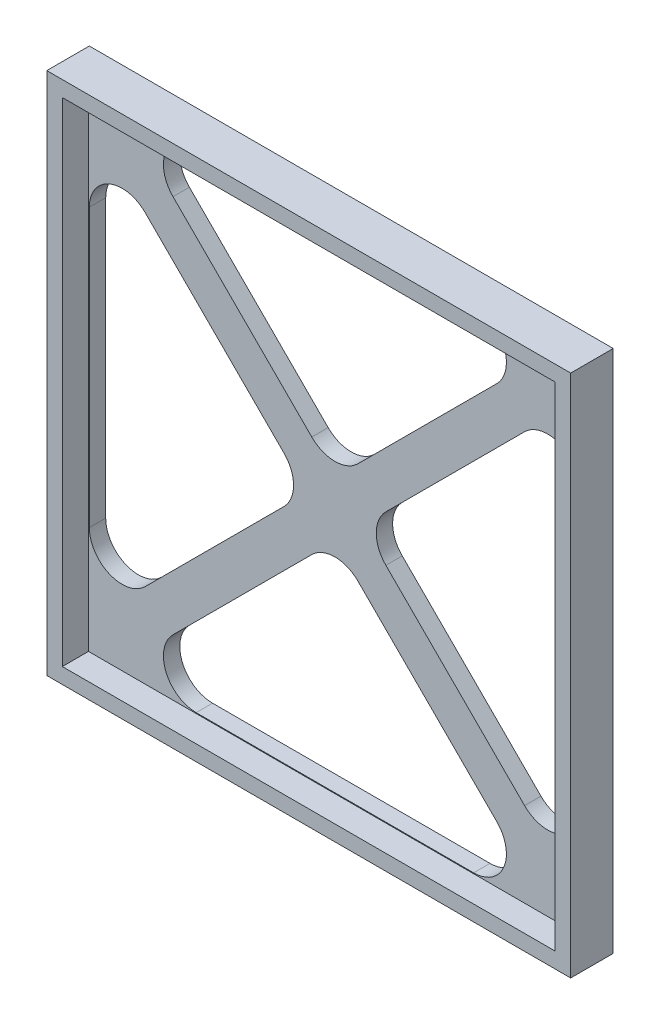
ISO-10303-21;
HEADER;
FILE_DESCRIPTION(('STEP AP214'),'2;1');
FILE_NAME('part.step','',(''),(''),'','','');
FILE_SCHEMA(('AUTOMOTIVE_DESIGN { 1 0 10303 214 1 1 1 1 }'));
ENDSEC;
DATA;
#1=APPLICATION_CONTEXT('core data for automotive mechanical design processes');
#2=APPLICATION_PROTOCOL_DEFINITION('international standard','automotive_design',2000,#1);
#3=PRODUCT_CONTEXT('',#1,'mechanical');
#4=PRODUCT('Part','Part','',(#3));
#5=PRODUCT_RELATED_PRODUCT_CATEGORY('part','',(#4));
#6=PRODUCT_DEFINITION_FORMATION('','',#4);
#7=PRODUCT_DEFINITION_CONTEXT('part definition',#1,'design');
#8=PRODUCT_DEFINITION('design','',#6,#7);
#9=PRODUCT_DEFINITION_SHAPE('','',#8);
#10=(LENGTH_UNIT() NAMED_UNIT(*) SI_UNIT(.MILLI.,.METRE.));
#11=(NAMED_UNIT(*) PLANE_ANGLE_UNIT() SI_UNIT($,.RADIAN.));
#12=(NAMED_UNIT(*) SI_UNIT($,.STERADIAN.) SOLID_ANGLE_UNIT());
#13=UNCERTAINTY_MEASURE_WITH_UNIT(LENGTH_MEASURE(1.E-05),#10,'distance_accuracy_value','');
#14=(GEOMETRIC_REPRESENTATION_CONTEXT(3) GLOBAL_UNCERTAINTY_ASSIGNED_CONTEXT((#13)) GLOBAL_UNIT_ASSIGNED_CONTEXT((#10,
#11,#12)) REPRESENTATION_CONTEXT('',''));
#15=CARTESIAN_POINT('',(0.,0.,0.));
#16=DIRECTION('',(0.,0.,1.));
#17=DIRECTION('',(1.,0.,0.));
#18=AXIS2_PLACEMENT_3D('',#15,#16,#17);
#19=CARTESIAN_POINT('',(0.,0.,5.));
#20=DIRECTION('',(0.,0.,1.));
#21=DIRECTION('',(1.,0.,0.));
#22=AXIS2_PLACEMENT_3D('',#19,#20,#21);
#23=PLANE('',#22);
#24=DIRECTION('',(1.,0.,0.));
#25=VECTOR('',#24,1.);
#26=CARTESIAN_POINT('',(75.,-75.,5.));
#27=LINE('',#26,#25);
#28=CARTESIAN_POINT('',(-42.3725830020305,-75.,5.));
#29=VERTEX_POINT('',#28);
#30=CARTESIAN_POINT('',(42.3725830020305,-75.,5.));
#31=VERTEX_POINT('',#30);
#32=EDGE_CURVE('E398',#29,#31,#27,.T.);
#33=ORIENTED_EDGE('',*,*,#32,.F.);
#34=CARTESIAN_POINT('',(-42.3725830020305,-65.,5.));
#35=DIRECTION('',(0.,0.,1.));
#36=DIRECTION('',(1.,0.,0.));
#37=AXIS2_PLACEMENT_3D('',#34,#35,#36);
#38=CIRCLE('',#37,10.);
#39=CARTESIAN_POINT('',(-49.443650813896,-57.9289321881345,5.));
#40=VERTEX_POINT('',#39);
#41=EDGE_CURVE('E550',#29,#40,#38,.F.);
#42=ORIENTED_EDGE('',*,*,#41,.T.);
#43=DIRECTION('',(0.707106781186547,0.707106781186548,0.));
#44=VECTOR('',#43,1.);
#45=CARTESIAN_POINT('',(0.,-8.48528137423856,5.));
#46=LINE('',#45,#44);
#47=CARTESIAN_POINT('',(-7.07106781186547,-15.556349186104,5.));
#48=VERTEX_POINT('',#47);
#49=EDGE_CURVE('E360',#40,#48,#46,.T.);
#50=ORIENTED_EDGE('',*,*,#49,.T.);
#51=CARTESIAN_POINT('',(0.,-22.6274169979695,5.));
#52=DIRECTION('',(0.,0.,1.));
#53=DIRECTION('',(1.,0.,0.));
#54=AXIS2_PLACEMENT_3D('',#51,#52,#53);
#55=CIRCLE('',#54,10.);
#56=CARTESIAN_POINT('',(7.07106781186548,-15.556349186104,5.));
#57=VERTEX_POINT('',#56);
#58=EDGE_CURVE('E556',#48,#57,#55,.F.);
#59=ORIENTED_EDGE('',*,*,#58,.T.);
#60=DIRECTION('',(0.707106781186548,-0.707106781186547,0.));
#61=VECTOR('',#60,1.);
#62=CARTESIAN_POINT('',(0.,-8.48528137423856,5.));
#63=LINE('',#62,#61);
#64=CARTESIAN_POINT('',(49.443650813896,-57.9289321881345,5.));
#65=VERTEX_POINT('',#64);
#66=EDGE_CURVE('E364',#57,#65,#63,.T.);
#67=ORIENTED_EDGE('',*,*,#66,.T.);
#68=CARTESIAN_POINT('',(42.3725830020305,-65.,5.));
#69=DIRECTION('',(0.,0.,1.));
#70=DIRECTION('',(1.,0.,0.));
#71=AXIS2_PLACEMENT_3D('',#68,#69,#70);
#72=CIRCLE('',#71,10.);
#73=EDGE_CURVE('E544',#65,#31,#72,.F.);
#74=ORIENTED_EDGE('',*,*,#73,.T.);
#75=EDGE_LOOP('',(#33,#42,#50,#59,#67,#74));
#76=FACE_BOUND('',#75,.T.);
#77=DIRECTION('',(0.,1.,0.));
#78=VECTOR('',#77,1.);
#79=CARTESIAN_POINT('',(75.,-75.,5.));
#80=LINE('',#79,#78);
#81=CARTESIAN_POINT('',(75.,-42.3725830020305,5.));
#82=VERTEX_POINT('',#81);
#83=CARTESIAN_POINT('',(75.,42.3725830020305,5.));
#84=VERTEX_POINT('',#83);
#85=EDGE_CURVE('E402',#82,#84,#80,.T.);
#86=ORIENTED_EDGE('',*,*,#85,.F.);
#87=CARTESIAN_POINT('',(65.,-42.3725830020305,5.));
#88=DIRECTION('',(0.,0.,1.));
#89=DIRECTION('',(1.,0.,0.));
#90=AXIS2_PLACEMENT_3D('',#87,#88,#89);
#91=CIRCLE('',#90,10.);
#92=CARTESIAN_POINT('',(57.9289321881345,-49.4436508138959,5.));
#93=VERTEX_POINT('',#92);
#94=EDGE_CURVE('E532',#82,#93,#91,.F.);
#95=ORIENTED_EDGE('',*,*,#94,.T.);
#96=DIRECTION('',(-0.707106781186548,0.707106781186547,0.));
#97=VECTOR('',#96,1.);
#98=CARTESIAN_POINT('',(8.48528137423857,0.,5.));
#99=LINE('',#98,#97);
#100=CARTESIAN_POINT('',(15.5563491861041,-7.0710678118655,5.));
#101=VERTEX_POINT('',#100);
#102=EDGE_CURVE('E368',#93,#101,#99,.T.);
#103=ORIENTED_EDGE('',*,*,#102,.T.);
#104=CARTESIAN_POINT('',(22.6274169979695,0.,5.));
#105=DIRECTION('',(0.,0.,1.));
#106=DIRECTION('',(1.,0.,0.));
#107=AXIS2_PLACEMENT_3D('',#104,#105,#106);
#108=CIRCLE('',#107,10.);
#109=CARTESIAN_POINT('',(15.5563491861041,7.07106781186545,5.));
#110=VERTEX_POINT('',#109);
#111=EDGE_CURVE('E538',#101,#110,#108,.F.);
#112=ORIENTED_EDGE('',*,*,#111,.T.);
#113=DIRECTION('',(0.707106781186547,0.707106781186548,0.));
#114=VECTOR('',#113,1.);
#115=CARTESIAN_POINT('',(75.,66.5147186257614,5.));
#116=LINE('',#115,#114);
#117=CARTESIAN_POINT('',(57.9289321881345,49.4436508138959,5.));
#118=VERTEX_POINT('',#117);
#119=EDGE_CURVE('E372',#110,#118,#116,.T.);
#120=ORIENTED_EDGE('',*,*,#119,.T.);
#121=CARTESIAN_POINT('',(65.,42.3725830020305,5.));
#122=DIRECTION('',(0.,0.,1.));
#123=DIRECTION('',(1.,0.,0.));
#124=AXIS2_PLACEMENT_3D('',#121,#122,#123);
#125=CIRCLE('',#124,10.);
#126=EDGE_CURVE('E526',#118,#84,#125,.F.);
#127=ORIENTED_EDGE('',*,*,#126,.T.);
#128=EDGE_LOOP('',(#86,#95,#103,#112,#120,#127));
#129=FACE_BOUND('',#128,.T.);
#130=DIRECTION('',(-1.,0.,0.));
#131=VECTOR('',#130,1.);
#132=CARTESIAN_POINT('',(75.,75.,5.));
#133=LINE('',#132,#131);
#134=CARTESIAN_POINT('',(42.3725830020305,75.,5.));
#135=VERTEX_POINT('',#134);
#136=CARTESIAN_POINT('',(-42.3725830020305,75.,5.));
#137=VERTEX_POINT('',#136);
#138=EDGE_CURVE('E406',#135,#137,#133,.T.);
#139=ORIENTED_EDGE('',*,*,#138,.F.);
#140=CARTESIAN_POINT('',(42.3725830020305,65.,5.));
#141=DIRECTION('',(0.,0.,1.));
#142=DIRECTION('',(1.,0.,0.));
#143=AXIS2_PLACEMENT_3D('',#140,#141,#142);
#144=CIRCLE('',#143,10.);
#145=CARTESIAN_POINT('',(49.443650813896,57.9289321881345,5.));
#146=VERTEX_POINT('',#145);
#147=EDGE_CURVE('E586',#135,#146,#144,.F.);
#148=ORIENTED_EDGE('',*,*,#147,.T.);
#149=DIRECTION('',(-0.707106781186548,-0.707106781186548,0.));
#150=VECTOR('',#149,1.);
#151=CARTESIAN_POINT('',(66.5147186257614,75.,5.));
#152=LINE('',#151,#150);
#153=CARTESIAN_POINT('',(7.07106781186545,15.556349186104,5.));
#154=VERTEX_POINT('',#153);
#155=EDGE_CURVE('E376',#146,#154,#152,.T.);
#156=ORIENTED_EDGE('',*,*,#155,.T.);
#157=CARTESIAN_POINT('',(0.,22.6274169979695,5.));
#158=DIRECTION('',(0.,0.,1.));
#159=DIRECTION('',(1.,0.,0.));
#160=AXIS2_PLACEMENT_3D('',#157,#158,#159);
#161=CIRCLE('',#160,10.);
#162=CARTESIAN_POINT('',(-7.07106781186547,15.556349186104,5.));
#163=VERTEX_POINT('',#162);
#164=EDGE_CURVE('E48',#154,#163,#161,.F.);
#165=ORIENTED_EDGE('',*,*,#164,.T.);
#166=DIRECTION('',(-0.707106781186548,0.707106781186547,0.));
#167=VECTOR('',#166,1.);
#168=CARTESIAN_POINT('',(-66.5147186257615,75.,5.));
#169=LINE('',#168,#167);
#170=CARTESIAN_POINT('',(-49.443650813896,57.9289321881345,5.));
#171=VERTEX_POINT('',#170);
#172=EDGE_CURVE('E325',#163,#171,#169,.T.);
#173=ORIENTED_EDGE('',*,*,#172,.T.);
#174=CARTESIAN_POINT('',(-42.3725830020305,65.,5.));
#175=DIRECTION('',(0.,0.,1.));
#176=DIRECTION('',(1.,0.,0.));
#177=AXIS2_PLACEMENT_3D('',#174,#175,#176);
#178=CIRCLE('',#177,10.);
#179=EDGE_CURVE('E580',#171,#137,#178,.F.);
#180=ORIENTED_EDGE('',*,*,#179,.T.);
#181=EDGE_LOOP('',(#139,#148,#156,#165,#173,#180));
#182=FACE_BOUND('',#181,.T.);
#183=DIRECTION('',(0.,-1.,0.));
#184=VECTOR('',#183,1.);
#185=CARTESIAN_POINT('',(-75.,-75.,5.));
#186=LINE('',#185,#184);
#187=CARTESIAN_POINT('',(-75.,42.3725830020305,5.));
#188=VERTEX_POINT('',#187);
#189=CARTESIAN_POINT('',(-75.,-42.3725830020305,5.));
#190=VERTEX_POINT('',#189);
#191=EDGE_CURVE('E394',#188,#190,#186,.T.);
#192=ORIENTED_EDGE('',*,*,#191,.F.);
#193=CARTESIAN_POINT('',(-65.,42.3725830020305,5.));
#194=DIRECTION('',(0.,0.,1.));
#195=DIRECTION('',(1.,0.,0.));
#196=AXIS2_PLACEMENT_3D('',#193,#194,#195);
#197=CIRCLE('',#196,10.);
#198=CARTESIAN_POINT('',(-57.9289321881345,49.443650813896,5.));
#199=VERTEX_POINT('',#198);
#200=EDGE_CURVE('E568',#188,#199,#197,.F.);
#201=ORIENTED_EDGE('',*,*,#200,.T.);
#202=DIRECTION('',(0.707106781186548,-0.707106781186548,0.));
#203=VECTOR('',#202,1.);
#204=CARTESIAN_POINT('',(-75.,66.5147186257614,5.));
#205=LINE('',#204,#203);
#206=CARTESIAN_POINT('',(-15.556349186104,7.07106781186544,5.));
#207=VERTEX_POINT('',#206);
#208=EDGE_CURVE('E319',#199,#207,#205,.T.);
#209=ORIENTED_EDGE('',*,*,#208,.T.);
#210=CARTESIAN_POINT('',(-22.6274169979695,0.,5.));
#211=DIRECTION('',(0.,0.,1.));
#212=DIRECTION('',(1.,0.,0.));
#213=AXIS2_PLACEMENT_3D('',#210,#211,#212);
#214=CIRCLE('',#213,10.);
#215=CARTESIAN_POINT('',(-15.556349186104,-7.07106781186549,5.));
#216=VERTEX_POINT('',#215);
#217=EDGE_CURVE('E574',#207,#216,#214,.F.);
#218=ORIENTED_EDGE('',*,*,#217,.T.);
#219=DIRECTION('',(-0.707106781186547,-0.707106781186548,0.));
#220=VECTOR('',#219,1.);
#221=CARTESIAN_POINT('',(-8.48528137423855,0.,5.));
#222=LINE('',#221,#220);
#223=CARTESIAN_POINT('',(-57.9289321881345,-49.443650813896,5.));
#224=VERTEX_POINT('',#223);
#225=EDGE_CURVE('E356',#216,#224,#222,.T.);
#226=ORIENTED_EDGE('',*,*,#225,.T.);
#227=CARTESIAN_POINT('',(-65.,-42.3725830020305,5.));
#228=DIRECTION('',(0.,0.,1.));
#229=DIRECTION('',(1.,0.,0.));
#230=AXIS2_PLACEMENT_3D('',#227,#228,#229);
#231=CIRCLE('',#230,10.);
#232=EDGE_CURVE('E562',#224,#190,#231,.F.);
#233=ORIENTED_EDGE('',*,*,#232,.T.);
#234=EDGE_LOOP('',(#192,#201,#209,#218,#226,#233));
#235=FACE_BOUND('',#234,.T.);
#236=DIRECTION('',(-1.,0.,0.));
#237=VECTOR('',#236,1.);
#238=CARTESIAN_POINT('',(75.25,75.25,5.));
#239=LINE('',#238,#237);
#240=CARTESIAN_POINT('',(75.25,75.25,5.));
#241=VERTEX_POINT('',#240);
#242=CARTESIAN_POINT('',(-75.25,75.25,5.));
#243=VERTEX_POINT('',#242);
#244=EDGE_CURVE('E262',#241,#243,#239,.T.);
#245=ORIENTED_EDGE('',*,*,#244,.T.);
#246=DIRECTION('',(0.,-1.,0.));
#247=VECTOR('',#246,1.);
#248=CARTESIAN_POINT('',(-75.25,-75.25,5.));
#249=LINE('',#248,#247);
#250=CARTESIAN_POINT('',(-75.25,-75.25,5.));
#251=VERTEX_POINT('',#250);
#252=EDGE_CURVE('E285',#243,#251,#249,.T.);
#253=ORIENTED_EDGE('',*,*,#252,.T.);
#254=DIRECTION('',(1.,0.,0.));
#255=VECTOR('',#254,1.);
#256=CARTESIAN_POINT('',(75.25,-75.25,5.));
#257=LINE('',#256,#255);
#258=CARTESIAN_POINT('',(75.25,-75.25,5.));
#259=VERTEX_POINT('',#258);
#260=EDGE_CURVE('E268',#251,#259,#257,.T.);
#261=ORIENTED_EDGE('',*,*,#260,.T.);
#262=DIRECTION('',(0.,1.,0.));
#263=VECTOR('',#262,1.);
#264=CARTESIAN_POINT('',(75.25,-75.25,5.));
#265=LINE('',#264,#263);
#266=EDGE_CURVE('E290',#259,#241,#265,.T.);
#267=ORIENTED_EDGE('',*,*,#266,.T.);
#268=EDGE_LOOP('',(#245,#253,#261,#267));
#269=FACE_BOUND('',#268,.T.);
#270=ADVANCED_FACE('F39',(#76,#129,#182,#235,#269),#23,.T.);
#271=CARTESIAN_POINT('',(-80.,80.,5.));
#272=DIRECTION('',(1.,0.,0.));
#273=DIRECTION('',(0.,1.,0.));
#274=AXIS2_PLACEMENT_3D('',#271,#272,#273);
#275=PLANE('',#274);
#276=DIRECTION('',(0.,-1.,0.));
#277=VECTOR('',#276,1.);
#278=CARTESIAN_POINT('',(-80.,80.,0.));
#279=LINE('',#278,#277);
#280=CARTESIAN_POINT('',(-80.,80.,0.));
#281=VERTEX_POINT('',#280);
#282=CARTESIAN_POINT('',(-80.,-80.,0.));
#283=VERTEX_POINT('',#282);
#284=EDGE_CURVE('E414',#281,#283,#279,.T.);
#285=ORIENTED_EDGE('',*,*,#284,.T.);
#286=DIRECTION('',(0.,0.,-1.));
#287=VECTOR('',#286,1.);
#288=CARTESIAN_POINT('',(-80.,-80.,5.));
#289=LINE('',#288,#287);
#290=CARTESIAN_POINT('',(-80.,-80.,13.));
#291=VERTEX_POINT('',#290);
#292=EDGE_CURVE('E439',#291,#283,#289,.T.);
#293=ORIENTED_EDGE('',*,*,#292,.F.);
#294=DIRECTION('',(0.,-1.,0.));
#295=VECTOR('',#294,1.);
#296=CARTESIAN_POINT('',(-80.,80.,13.));
#297=LINE('',#296,#295);
#298=CARTESIAN_POINT('',(-80.,80.,13.));
#299=VERTEX_POINT('',#298);
#300=EDGE_CURVE('E270',#299,#291,#297,.T.);
#301=ORIENTED_EDGE('',*,*,#300,.F.);
#302=DIRECTION('',(0.,0.,-1.));
#303=VECTOR('',#302,1.);
#304=CARTESIAN_POINT('',(-80.,80.,5.));
#305=LINE('',#304,#303);
#306=EDGE_CURVE('E427',#299,#281,#305,.T.);
#307=ORIENTED_EDGE('',*,*,#306,.T.);
#308=EDGE_LOOP('',(#285,#293,#301,#307));
#309=FACE_BOUND('',#308,.T.);
#310=ADVANCED_FACE('F627',(#309),#275,.F.);
#311=CARTESIAN_POINT('',(-80.,-80.,5.));
#312=DIRECTION('',(0.,1.,0.));
#313=DIRECTION('',(-1.,0.,0.));
#314=AXIS2_PLACEMENT_3D('',#311,#312,#313);
#315=PLANE('',#314);
#316=DIRECTION('',(1.,0.,0.));
#317=VECTOR('',#316,1.);
#318=CARTESIAN_POINT('',(-80.,-80.,0.));
#319=LINE('',#318,#317);
#320=CARTESIAN_POINT('',(80.,-80.,0.));
#321=VERTEX_POINT('',#320);
#322=EDGE_CURVE('E418',#283,#321,#319,.T.);
#323=ORIENTED_EDGE('',*,*,#322,.T.);
#324=DIRECTION('',(0.,0.,-1.));
#325=VECTOR('',#324,1.);
#326=CARTESIAN_POINT('',(80.,-80.,5.));
#327=LINE('',#326,#325);
#328=CARTESIAN_POINT('',(80.,-80.,13.));
#329=VERTEX_POINT('',#328);
#330=EDGE_CURVE('E435',#329,#321,#327,.T.);
#331=ORIENTED_EDGE('',*,*,#330,.F.);
#332=DIRECTION('',(1.,0.,0.));
#333=VECTOR('',#332,1.);
#334=CARTESIAN_POINT('',(-80.,-80.,13.));
#335=LINE('',#334,#333);
#336=EDGE_CURVE('E307',#291,#329,#335,.T.);
#337=ORIENTED_EDGE('',*,*,#336,.F.);
#338=ORIENTED_EDGE('',*,*,#292,.T.);
#339=EDGE_LOOP('',(#323,#331,#337,#338));
#340=FACE_BOUND('',#339,.T.);
#341=ADVANCED_FACE('F633',(#340),#315,.F.);
#342=CARTESIAN_POINT('',(80.,80.,5.));
#343=DIRECTION('',(-1.,0.,0.));
#344=DIRECTION('',(0.,-1.,0.));
#345=AXIS2_PLACEMENT_3D('',#342,#343,#344);
#346=PLANE('',#345);
#347=DIRECTION('',(0.,1.,0.));
#348=VECTOR('',#347,1.);
#349=CARTESIAN_POINT('',(80.,80.,0.));
#350=LINE('',#349,#348);
#351=CARTESIAN_POINT('',(80.,80.,0.));
#352=VERTEX_POINT('',#351);
#353=EDGE_CURVE('E421',#321,#352,#350,.T.);
#354=ORIENTED_EDGE('',*,*,#353,.T.);
#355=DIRECTION('',(0.,0.,-1.));
#356=VECTOR('',#355,1.);
#357=CARTESIAN_POINT('',(80.,80.,5.));
#358=LINE('',#357,#356);
#359=CARTESIAN_POINT('',(80.,80.,13.));
#360=VERTEX_POINT('',#359);
#361=EDGE_CURVE('E431',#360,#352,#358,.T.);
#362=ORIENTED_EDGE('',*,*,#361,.F.);
#363=DIRECTION('',(0.,1.,0.));
#364=VECTOR('',#363,1.);
#365=CARTESIAN_POINT('',(80.,80.,13.));
#366=LINE('',#365,#364);
#367=EDGE_CURVE('E311',#329,#360,#366,.T.);
#368=ORIENTED_EDGE('',*,*,#367,.F.);
#369=ORIENTED_EDGE('',*,*,#330,.T.);
#370=EDGE_LOOP('',(#354,#362,#368,#369));
#371=FACE_BOUND('',#370,.T.);
#372=ADVANCED_FACE('F648',(#371),#346,.F.);
#373=CARTESIAN_POINT('',(-80.,80.,5.));
#374=DIRECTION('',(0.,-1.,0.));
#375=DIRECTION('',(1.,0.,0.));
#376=AXIS2_PLACEMENT_3D('',#373,#374,#375);
#377=PLANE('',#376);
#378=DIRECTION('',(-1.,0.,0.));
#379=VECTOR('',#378,1.);
#380=CARTESIAN_POINT('',(-80.,80.,0.));
#381=LINE('',#380,#379);
#382=EDGE_CURVE('E424',#352,#281,#381,.T.);
#383=ORIENTED_EDGE('',*,*,#382,.T.);
#384=ORIENTED_EDGE('',*,*,#306,.F.);
#385=DIRECTION('',(-1.,0.,0.));
#386=VECTOR('',#385,1.);
#387=CARTESIAN_POINT('',(-80.,80.,13.));
#388=LINE('',#387,#386);
#389=EDGE_CURVE('E315',#360,#299,#388,.T.);
#390=ORIENTED_EDGE('',*,*,#389,.F.);
#391=ORIENTED_EDGE('',*,*,#361,.T.);
#392=EDGE_LOOP('',(#383,#384,#390,#391));
#393=FACE_BOUND('',#392,.T.);
#394=ADVANCED_FACE('F644',(#393),#377,.F.);
#395=CARTESIAN_POINT('',(0.,0.,0.));
#396=DIRECTION('',(0.,0.,1.));
#397=DIRECTION('',(1.,0.,0.));
#398=AXIS2_PLACEMENT_3D('',#395,#396,#397);
#399=PLANE('',#398);
#400=DIRECTION('',(0.707106781186548,-0.707106781186548,0.));
#401=VECTOR('',#400,1.);
#402=CARTESIAN_POINT('',(-75.,66.5147186257614,0.));
#403=LINE('',#402,#401);
#404=CARTESIAN_POINT('',(-57.9289321881345,49.443650813896,0.));
#405=VERTEX_POINT('',#404);
#406=CARTESIAN_POINT('',(-15.556349186104,7.07106781186544,0.));
#407=VERTEX_POINT('',#406);
#408=EDGE_CURVE('E320',#405,#407,#403,.T.);
#409=ORIENTED_EDGE('',*,*,#408,.F.);
#410=CARTESIAN_POINT('',(-65.,42.3725830020305,0.));
#411=DIRECTION('',(0.,0.,1.));
#412=DIRECTION('',(1.,0.,0.));
#413=AXIS2_PLACEMENT_3D('',#410,#411,#412);
#414=CIRCLE('',#413,10.);
#415=CARTESIAN_POINT('',(-75.,42.3725830020305,0.));
#416=VERTEX_POINT('',#415);
#417=EDGE_CURVE('E571',#405,#416,#414,.T.);
#418=ORIENTED_EDGE('',*,*,#417,.T.);
#419=DIRECTION('',(0.,1.,0.));
#420=VECTOR('',#419,1.);
#421=CARTESIAN_POINT('',(-75.,-75.,0.));
#422=LINE('',#421,#420);
#423=CARTESIAN_POINT('',(-75.,-42.3725830020305,0.));
#424=VERTEX_POINT('',#423);
#425=EDGE_CURVE('E390',#424,#416,#422,.T.);
#426=ORIENTED_EDGE('',*,*,#425,.F.);
#427=CARTESIAN_POINT('',(-65.,-42.3725830020305,0.));
#428=DIRECTION('',(0.,0.,1.));
#429=DIRECTION('',(1.,0.,0.));
#430=AXIS2_PLACEMENT_3D('',#427,#428,#429);
#431=CIRCLE('',#430,10.);
#432=CARTESIAN_POINT('',(-57.9289321881345,-49.443650813896,0.));
#433=VERTEX_POINT('',#432);
#434=EDGE_CURVE('E565',#424,#433,#431,.T.);
#435=ORIENTED_EDGE('',*,*,#434,.T.);
#436=DIRECTION('',(-0.707106781186547,-0.707106781186548,0.));
#437=VECTOR('',#436,1.);
#438=CARTESIAN_POINT('',(-8.48528137423855,0.,0.));
#439=LINE('',#438,#437);
#440=CARTESIAN_POINT('',(-15.556349186104,-7.07106781186549,0.));
#441=VERTEX_POINT('',#440);
#442=EDGE_CURVE('E324',#441,#433,#439,.T.);
#443=ORIENTED_EDGE('',*,*,#442,.F.);
#444=CARTESIAN_POINT('',(-22.6274169979695,0.,0.));
#445=DIRECTION('',(0.,0.,1.));
#446=DIRECTION('',(1.,0.,0.));
#447=AXIS2_PLACEMENT_3D('',#444,#445,#446);
#448=CIRCLE('',#447,10.);
#449=EDGE_CURVE('E577',#441,#407,#448,.T.);
#450=ORIENTED_EDGE('',*,*,#449,.T.);
#451=EDGE_LOOP('',(#409,#418,#426,#435,#443,#450));
#452=FACE_BOUND('',#451,.T.);
#453=DIRECTION('',(-0.707106781186548,-0.707106781186548,0.));
#454=VECTOR('',#453,1.);
#455=CARTESIAN_POINT('',(66.5147186257614,75.,0.));
#456=LINE('',#455,#454);
#457=CARTESIAN_POINT('',(49.443650813896,57.9289321881345,0.));
#458=VERTEX_POINT('',#457);
#459=CARTESIAN_POINT('',(7.07106781186545,15.556349186104,0.));
#460=VERTEX_POINT('',#459);
#461=EDGE_CURVE('E345',#458,#460,#456,.T.);
#462=ORIENTED_EDGE('',*,*,#461,.F.);
#463=CARTESIAN_POINT('',(42.3725830020305,65.,0.));
#464=DIRECTION('',(0.,0.,1.));
#465=DIRECTION('',(1.,0.,0.));
#466=AXIS2_PLACEMENT_3D('',#463,#464,#465);
#467=CIRCLE('',#466,10.);
#468=CARTESIAN_POINT('',(42.3725830020305,75.,0.));
#469=VERTEX_POINT('',#468);
#470=EDGE_CURVE('E589',#458,#469,#467,.T.);
#471=ORIENTED_EDGE('',*,*,#470,.T.);
#472=DIRECTION('',(1.,0.,0.));
#473=VECTOR('',#472,1.);
#474=CARTESIAN_POINT('',(75.,75.,0.));
#475=LINE('',#474,#473);
#476=CARTESIAN_POINT('',(-42.3725830020305,75.,0.));
#477=VERTEX_POINT('',#476);
#478=EDGE_CURVE('E386',#477,#469,#475,.T.);
#479=ORIENTED_EDGE('',*,*,#478,.F.);
#480=CARTESIAN_POINT('',(-42.3725830020305,65.,0.));
#481=DIRECTION('',(0.,0.,1.));
#482=DIRECTION('',(1.,0.,0.));
#483=AXIS2_PLACEMENT_3D('',#480,#481,#482);
#484=CIRCLE('',#483,10.);
#485=CARTESIAN_POINT('',(-49.443650813896,57.9289321881345,0.));
#486=VERTEX_POINT('',#485);
#487=EDGE_CURVE('E583',#477,#486,#484,.T.);
#488=ORIENTED_EDGE('',*,*,#487,.T.);
#489=DIRECTION('',(-0.707106781186548,0.707106781186547,0.));
#490=VECTOR('',#489,1.);
#491=CARTESIAN_POINT('',(-66.5147186257615,75.,0.));
#492=LINE('',#491,#490);
#493=CARTESIAN_POINT('',(-7.07106781186547,15.556349186104,0.));
#494=VERTEX_POINT('',#493);
#495=EDGE_CURVE('E348',#494,#486,#492,.T.);
#496=ORIENTED_EDGE('',*,*,#495,.F.);
#497=CARTESIAN_POINT('',(0.,22.6274169979695,0.));
#498=DIRECTION('',(0.,0.,1.));
#499=DIRECTION('',(1.,0.,0.));
#500=AXIS2_PLACEMENT_3D('',#497,#498,#499);
#501=CIRCLE('',#500,10.);
#502=EDGE_CURVE('E11',#494,#460,#501,.T.);
#503=ORIENTED_EDGE('',*,*,#502,.T.);
#504=EDGE_LOOP('',(#462,#471,#479,#488,#496,#503));
#505=FACE_BOUND('',#504,.T.);
#506=DIRECTION('',(-0.707106781186548,0.707106781186547,0.));
#507=VECTOR('',#506,1.);
#508=CARTESIAN_POINT('',(8.48528137423857,0.,0.));
#509=LINE('',#508,#507);
#510=CARTESIAN_POINT('',(57.9289321881345,-49.4436508138959,0.));
#511=VERTEX_POINT('',#510);
#512=CARTESIAN_POINT('',(15.5563491861041,-7.0710678118655,0.));
#513=VERTEX_POINT('',#512);
#514=EDGE_CURVE('E337',#511,#513,#509,.T.);
#515=ORIENTED_EDGE('',*,*,#514,.F.);
#516=CARTESIAN_POINT('',(65.,-42.3725830020305,0.));
#517=DIRECTION('',(0.,0.,1.));
#518=DIRECTION('',(1.,0.,0.));
#519=AXIS2_PLACEMENT_3D('',#516,#517,#518);
#520=CIRCLE('',#519,10.);
#521=CARTESIAN_POINT('',(75.,-42.3725830020305,0.));
#522=VERTEX_POINT('',#521);
#523=EDGE_CURVE('E535',#511,#522,#520,.T.);
#524=ORIENTED_EDGE('',*,*,#523,.T.);
#525=DIRECTION('',(0.,-1.,0.));
#526=VECTOR('',#525,1.);
#527=CARTESIAN_POINT('',(75.,-75.,0.));
#528=LINE('',#527,#526);
#529=CARTESIAN_POINT('',(75.,42.3725830020305,0.));
#530=VERTEX_POINT('',#529);
#531=EDGE_CURVE('E352',#530,#522,#528,.T.);
#532=ORIENTED_EDGE('',*,*,#531,.F.);
#533=CARTESIAN_POINT('',(65.,42.3725830020305,0.));
#534=DIRECTION('',(0.,0.,1.));
#535=DIRECTION('',(1.,0.,0.));
#536=AXIS2_PLACEMENT_3D('',#533,#534,#535);
#537=CIRCLE('',#536,10.);
#538=CARTESIAN_POINT('',(57.9289321881345,49.4436508138959,0.));
#539=VERTEX_POINT('',#538);
#540=EDGE_CURVE('E529',#530,#539,#537,.T.);
#541=ORIENTED_EDGE('',*,*,#540,.T.);
#542=DIRECTION('',(0.707106781186547,0.707106781186548,0.));
#543=VECTOR('',#542,1.);
#544=CARTESIAN_POINT('',(75.,66.5147186257614,0.));
#545=LINE('',#544,#543);
#546=CARTESIAN_POINT('',(15.5563491861041,7.07106781186545,0.));
#547=VERTEX_POINT('',#546);
#548=EDGE_CURVE('E341',#547,#539,#545,.T.);
#549=ORIENTED_EDGE('',*,*,#548,.F.);
#550=CARTESIAN_POINT('',(22.6274169979695,0.,0.));
#551=DIRECTION('',(0.,0.,1.));
#552=DIRECTION('',(1.,0.,0.));
#553=AXIS2_PLACEMENT_3D('',#550,#551,#552);
#554=CIRCLE('',#553,10.);
#555=EDGE_CURVE('E541',#547,#513,#554,.T.);
#556=ORIENTED_EDGE('',*,*,#555,.T.);
#557=EDGE_LOOP('',(#515,#524,#532,#541,#549,#556));
#558=FACE_BOUND('',#557,.T.);
#559=DIRECTION('',(0.707106781186547,0.707106781186548,0.));
#560=VECTOR('',#559,1.);
#561=CARTESIAN_POINT('',(0.,-8.48528137423856,0.));
#562=LINE('',#561,#560);
#563=CARTESIAN_POINT('',(-49.443650813896,-57.9289321881345,0.));
#564=VERTEX_POINT('',#563);
#565=CARTESIAN_POINT('',(-7.07106781186547,-15.556349186104,0.));
#566=VERTEX_POINT('',#565);
#567=EDGE_CURVE('E329',#564,#566,#562,.T.);
#568=ORIENTED_EDGE('',*,*,#567,.F.);
#569=CARTESIAN_POINT('',(-42.3725830020305,-65.,0.));
#570=DIRECTION('',(0.,0.,1.));
#571=DIRECTION('',(1.,0.,0.));
#572=AXIS2_PLACEMENT_3D('',#569,#570,#571);
#573=CIRCLE('',#572,10.);
#574=CARTESIAN_POINT('',(-42.3725830020305,-75.,0.));
#575=VERTEX_POINT('',#574);
#576=EDGE_CURVE('E553',#564,#575,#573,.T.);
#577=ORIENTED_EDGE('',*,*,#576,.T.);
#578=DIRECTION('',(-1.,0.,0.));
#579=VECTOR('',#578,1.);
#580=CARTESIAN_POINT('',(75.,-75.,0.));
#581=LINE('',#580,#579);
#582=CARTESIAN_POINT('',(42.3725830020305,-75.,0.));
#583=VERTEX_POINT('',#582);
#584=EDGE_CURVE('E410',#583,#575,#581,.T.);
#585=ORIENTED_EDGE('',*,*,#584,.F.);
#586=CARTESIAN_POINT('',(42.3725830020305,-65.,0.));
#587=DIRECTION('',(0.,0.,1.));
#588=DIRECTION('',(1.,0.,0.));
#589=AXIS2_PLACEMENT_3D('',#586,#587,#588);
#590=CIRCLE('',#589,10.);
#591=CARTESIAN_POINT('',(49.443650813896,-57.9289321881345,0.));
#592=VERTEX_POINT('',#591);
#593=EDGE_CURVE('E547',#583,#592,#590,.T.);
#594=ORIENTED_EDGE('',*,*,#593,.T.);
#595=DIRECTION('',(0.707106781186548,-0.707106781186547,0.));
#596=VECTOR('',#595,1.);
#597=CARTESIAN_POINT('',(0.,-8.48528137423856,0.));
#598=LINE('',#597,#596);
#599=CARTESIAN_POINT('',(7.07106781186548,-15.556349186104,0.));
#600=VERTEX_POINT('',#599);
#601=EDGE_CURVE('E333',#600,#592,#598,.T.);
#602=ORIENTED_EDGE('',*,*,#601,.F.);
#603=CARTESIAN_POINT('',(0.,-22.6274169979695,0.));
#604=DIRECTION('',(0.,0.,1.));
#605=DIRECTION('',(1.,0.,0.));
#606=AXIS2_PLACEMENT_3D('',#603,#604,#605);
#607=CIRCLE('',#606,10.);
#608=EDGE_CURVE('E559',#600,#566,#607,.T.);
#609=ORIENTED_EDGE('',*,*,#608,.T.);
#610=EDGE_LOOP('',(#568,#577,#585,#594,#602,#609));
#611=FACE_BOUND('',#610,.T.);
#612=ORIENTED_EDGE('',*,*,#284,.F.);
#613=ORIENTED_EDGE('',*,*,#382,.F.);
#614=ORIENTED_EDGE('',*,*,#353,.F.);
#615=ORIENTED_EDGE('',*,*,#322,.F.);
#616=EDGE_LOOP('',(#612,#613,#614,#615));
#617=FACE_BOUND('',#616,.T.);
#618=ADVANCED_FACE('F604',(#452,#505,#558,#611,#617),#399,.F.);
#619=CARTESIAN_POINT('',(-75.,-75.,-0.00100000000000013));
#620=DIRECTION('',(-1.,0.,0.));
#621=DIRECTION('',(0.,0.,1.));
#622=AXIS2_PLACEMENT_3D('',#619,#620,#621);
#623=PLANE('',#622);
#624=ORIENTED_EDGE('',*,*,#191,.T.);
#625=DIRECTION('',(0.,0.,1.));
#626=VECTOR('',#625,1.);
#627=CARTESIAN_POINT('',(-75.,-42.3725830020305,-0.00100000000000013));
#628=LINE('',#627,#626);
#629=EDGE_CURVE('E496',#190,#424,#628,.F.);
#630=ORIENTED_EDGE('',*,*,#629,.T.);
#631=ORIENTED_EDGE('',*,*,#425,.T.);
#632=DIRECTION('',(0.,0.,1.));
#633=VECTOR('',#632,1.);
#634=CARTESIAN_POINT('',(-75.,42.3725830020305,-0.00100000000000013));
#635=LINE('',#634,#633);
#636=EDGE_CURVE('E492',#416,#188,#635,.T.);
#637=ORIENTED_EDGE('',*,*,#636,.T.);
#638=EDGE_LOOP('',(#624,#630,#631,#637));
#639=FACE_BOUND('',#638,.T.);
#640=ADVANCED_FACE('F640',(#639),#623,.F.);
#641=CARTESIAN_POINT('',(75.,75.,-0.00100000000000013));
#642=DIRECTION('',(0.,1.,0.));
#643=DIRECTION('',(-1.,0.,0.));
#644=AXIS2_PLACEMENT_3D('',#641,#642,#643);
#645=PLANE('',#644);
#646=ORIENTED_EDGE('',*,*,#138,.T.);
#647=DIRECTION('',(0.,0.,1.));
#648=VECTOR('',#647,1.);
#649=CARTESIAN_POINT('',(-42.3725830020305,75.,-0.00100000000000013));
#650=LINE('',#649,#648);
#651=EDGE_CURVE('E517',#137,#477,#650,.F.);
#652=ORIENTED_EDGE('',*,*,#651,.T.);
#653=ORIENTED_EDGE('',*,*,#478,.T.);
#654=DIRECTION('',(0.,0.,1.));
#655=VECTOR('',#654,1.);
#656=CARTESIAN_POINT('',(42.3725830020305,75.,-0.00100000000000013));
#657=LINE('',#656,#655);
#658=EDGE_CURVE('E513',#469,#135,#657,.T.);
#659=ORIENTED_EDGE('',*,*,#658,.T.);
#660=EDGE_LOOP('',(#646,#652,#653,#659));
#661=FACE_BOUND('',#660,.T.);
#662=ADVANCED_FACE('F611',(#661),#645,.F.);
#663=CARTESIAN_POINT('',(75.,-75.,-0.00100000000000013));
#664=DIRECTION('',(1.,0.,0.));
#665=DIRECTION('',(0.,0.,-1.));
#666=AXIS2_PLACEMENT_3D('',#663,#664,#665);
#667=PLANE('',#666);
#668=ORIENTED_EDGE('',*,*,#85,.T.);
#669=DIRECTION('',(0.,0.,1.));
#670=VECTOR('',#669,1.);
#671=CARTESIAN_POINT('',(75.,42.3725830020305,-0.00100000000000013));
#672=LINE('',#671,#670);
#673=EDGE_CURVE('E454',#84,#530,#672,.F.);
#674=ORIENTED_EDGE('',*,*,#673,.T.);
#675=ORIENTED_EDGE('',*,*,#531,.T.);
#676=DIRECTION('',(0.,0.,1.));
#677=VECTOR('',#676,1.);
#678=CARTESIAN_POINT('',(75.,-42.3725830020305,-0.00100000000000013));
#679=LINE('',#678,#677);
#680=EDGE_CURVE('E450',#522,#82,#679,.T.);
#681=ORIENTED_EDGE('',*,*,#680,.T.);
#682=EDGE_LOOP('',(#668,#674,#675,#681));
#683=FACE_BOUND('',#682,.T.);
#684=ADVANCED_FACE('F756',(#683),#667,.F.);
#685=CARTESIAN_POINT('',(75.,-75.,-0.00100000000000013));
#686=DIRECTION('',(0.,-1.,0.));
#687=DIRECTION('',(1.,0.,0.));
#688=AXIS2_PLACEMENT_3D('',#685,#686,#687);
#689=PLANE('',#688);
#690=ORIENTED_EDGE('',*,*,#32,.T.);
#691=DIRECTION('',(0.,0.,1.));
#692=VECTOR('',#691,1.);
#693=CARTESIAN_POINT('',(42.3725830020305,-75.,-0.00100000000000013));
#694=LINE('',#693,#692);
#695=EDGE_CURVE('E475',#31,#583,#694,.F.);
#696=ORIENTED_EDGE('',*,*,#695,.T.);
#697=ORIENTED_EDGE('',*,*,#584,.T.);
#698=DIRECTION('',(0.,0.,1.));
#699=VECTOR('',#698,1.);
#700=CARTESIAN_POINT('',(-42.3725830020305,-75.,-0.00100000000000013));
#701=LINE('',#700,#699);
#702=EDGE_CURVE('E471',#575,#29,#701,.T.);
#703=ORIENTED_EDGE('',*,*,#702,.T.);
#704=EDGE_LOOP('',(#690,#696,#697,#703));
#705=FACE_BOUND('',#704,.T.);
#706=ADVANCED_FACE('F731',(#705),#689,.F.);
#707=CARTESIAN_POINT('',(-66.5147186257615,75.,0.));
#708=DIRECTION('',(0.707106781186547,0.707106781186548,0.));
#709=DIRECTION('',(-0.707106781186548,0.707106781186547,0.));
#710=AXIS2_PLACEMENT_3D('',#707,#708,#709);
#711=PLANE('',#710);
#712=ORIENTED_EDGE('',*,*,#495,.T.);
#713=DIRECTION('',(0.,0.,1.));
#714=VECTOR('',#713,1.);
#715=CARTESIAN_POINT('',(-49.443650813896,57.9289321881345,0.));
#716=LINE('',#715,#714);
#717=EDGE_CURVE('E509',#486,#171,#716,.T.);
#718=ORIENTED_EDGE('',*,*,#717,.T.);
#719=ORIENTED_EDGE('',*,*,#172,.F.);
#720=DIRECTION('',(0.,0.,1.));
#721=VECTOR('',#720,1.);
#722=CARTESIAN_POINT('',(-7.07106781186548,15.556349186104,0.));
#723=LINE('',#722,#721);
#724=EDGE_CURVE('E506',#163,#494,#723,.F.);
#725=ORIENTED_EDGE('',*,*,#724,.T.);
#726=EDGE_LOOP('',(#712,#718,#719,#725));
#727=FACE_BOUND('',#726,.T.);
#728=ADVANCED_FACE('F600',(#727),#711,.T.);
#729=CARTESIAN_POINT('',(66.5147186257614,75.,0.));
#730=DIRECTION('',(-0.707106781186548,0.707106781186548,0.));
#731=DIRECTION('',(-0.707106781186548,-0.707106781186548,0.));
#732=AXIS2_PLACEMENT_3D('',#729,#730,#731);
#733=PLANE('',#732);
#734=ORIENTED_EDGE('',*,*,#155,.F.);
#735=DIRECTION('',(0.,0.,1.));
#736=VECTOR('',#735,1.);
#737=CARTESIAN_POINT('',(49.443650813896,57.9289321881345,0.));
#738=LINE('',#737,#736);
#739=EDGE_CURVE('E60',#146,#458,#738,.F.);
#740=ORIENTED_EDGE('',*,*,#739,.T.);
#741=ORIENTED_EDGE('',*,*,#461,.T.);
#742=DIRECTION('',(0.,0.,1.));
#743=VECTOR('',#742,1.);
#744=CARTESIAN_POINT('',(7.07106781186547,15.556349186104,5.));
#745=LINE('',#744,#743);
#746=EDGE_CURVE('E520',#460,#154,#745,.T.);
#747=ORIENTED_EDGE('',*,*,#746,.T.);
#748=EDGE_LOOP('',(#734,#740,#741,#747));
#749=FACE_BOUND('',#748,.T.);
#750=ADVANCED_FACE('F602',(#749),#733,.T.);
#751=CARTESIAN_POINT('',(75.,66.5147186257614,0.));
#752=DIRECTION('',(0.707106781186548,-0.707106781186547,0.));
#753=DIRECTION('',(0.707106781186547,0.707106781186548,0.));
#754=AXIS2_PLACEMENT_3D('',#751,#752,#753);
#755=PLANE('',#754);
#756=ORIENTED_EDGE('',*,*,#548,.T.);
#757=DIRECTION('',(0.,0.,1.));
#758=VECTOR('',#757,1.);
#759=CARTESIAN_POINT('',(57.9289321881345,49.4436508138959,0.));
#760=LINE('',#759,#758);
#761=EDGE_CURVE('E446',#539,#118,#760,.T.);
#762=ORIENTED_EDGE('',*,*,#761,.T.);
#763=ORIENTED_EDGE('',*,*,#119,.F.);
#764=DIRECTION('',(0.,0.,1.));
#765=VECTOR('',#764,1.);
#766=CARTESIAN_POINT('',(15.5563491861041,7.07106781186546,0.));
#767=LINE('',#766,#765);
#768=EDGE_CURVE('E443',#110,#547,#767,.F.);
#769=ORIENTED_EDGE('',*,*,#768,.T.);
#770=EDGE_LOOP('',(#756,#762,#763,#769));
#771=FACE_BOUND('',#770,.T.);
#772=ADVANCED_FACE('F734',(#771),#755,.T.);
#773=CARTESIAN_POINT('',(8.48528137423857,0.,0.));
#774=DIRECTION('',(0.707106781186547,0.707106781186548,0.));
#775=DIRECTION('',(-0.707106781186548,0.707106781186547,0.));
#776=AXIS2_PLACEMENT_3D('',#773,#774,#775);
#777=PLANE('',#776);
#778=ORIENTED_EDGE('',*,*,#102,.F.);
#779=DIRECTION('',(0.,0.,1.));
#780=VECTOR('',#779,1.);
#781=CARTESIAN_POINT('',(57.9289321881345,-49.4436508138959,0.));
#782=LINE('',#781,#780);
#783=EDGE_CURVE('E461',#93,#511,#782,.F.);
#784=ORIENTED_EDGE('',*,*,#783,.T.);
#785=ORIENTED_EDGE('',*,*,#514,.T.);
#786=DIRECTION('',(0.,0.,1.));
#787=VECTOR('',#786,1.);
#788=CARTESIAN_POINT('',(15.5563491861041,-7.0710678118655,5.));
#789=LINE('',#788,#787);
#790=EDGE_CURVE('E457',#513,#101,#789,.T.);
#791=ORIENTED_EDGE('',*,*,#790,.T.);
#792=EDGE_LOOP('',(#778,#784,#785,#791));
#793=FACE_BOUND('',#792,.T.);
#794=ADVANCED_FACE('F737',(#793),#777,.T.);
#795=CARTESIAN_POINT('',(0.,-8.48528137423856,0.));
#796=DIRECTION('',(-0.707106781186547,-0.707106781186548,0.));
#797=DIRECTION('',(0.707106781186548,-0.707106781186547,0.));
#798=AXIS2_PLACEMENT_3D('',#795,#796,#797);
#799=PLANE('',#798);
#800=ORIENTED_EDGE('',*,*,#601,.T.);
#801=DIRECTION('',(0.,0.,1.));
#802=VECTOR('',#801,1.);
#803=CARTESIAN_POINT('',(49.443650813896,-57.9289321881345,0.));
#804=LINE('',#803,#802);
#805=EDGE_CURVE('E467',#592,#65,#804,.T.);
#806=ORIENTED_EDGE('',*,*,#805,.T.);
#807=ORIENTED_EDGE('',*,*,#66,.F.);
#808=DIRECTION('',(0.,0.,1.));
#809=VECTOR('',#808,1.);
#810=CARTESIAN_POINT('',(7.07106781186548,-15.556349186104,0.));
#811=LINE('',#810,#809);
#812=EDGE_CURVE('E464',#57,#600,#811,.F.);
#813=ORIENTED_EDGE('',*,*,#812,.T.);
#814=EDGE_LOOP('',(#800,#806,#807,#813));
#815=FACE_BOUND('',#814,.T.);
#816=ADVANCED_FACE('F741',(#815),#799,.T.);
#817=CARTESIAN_POINT('',(0.,-8.48528137423856,0.));
#818=DIRECTION('',(0.707106781186548,-0.707106781186547,0.));
#819=DIRECTION('',(0.707106781186547,0.707106781186548,0.));
#820=AXIS2_PLACEMENT_3D('',#817,#818,#819);
#821=PLANE('',#820);
#822=ORIENTED_EDGE('',*,*,#49,.F.);
#823=DIRECTION('',(0.,0.,1.));
#824=VECTOR('',#823,1.);
#825=CARTESIAN_POINT('',(-49.443650813896,-57.9289321881345,0.));
#826=LINE('',#825,#824);
#827=EDGE_CURVE('E482',#40,#564,#826,.F.);
#828=ORIENTED_EDGE('',*,*,#827,.T.);
#829=ORIENTED_EDGE('',*,*,#567,.T.);
#830=DIRECTION('',(0.,0.,1.));
#831=VECTOR('',#830,1.);
#832=CARTESIAN_POINT('',(-7.07106781186547,-15.556349186104,5.));
#833=LINE('',#832,#831);
#834=EDGE_CURVE('E478',#566,#48,#833,.T.);
#835=ORIENTED_EDGE('',*,*,#834,.T.);
#836=EDGE_LOOP('',(#822,#828,#829,#835));
#837=FACE_BOUND('',#836,.T.);
#838=ADVANCED_FACE('F745',(#837),#821,.T.);
#839=CARTESIAN_POINT('',(-8.48528137423855,0.,0.));
#840=DIRECTION('',(-0.707106781186548,0.707106781186547,0.));
#841=DIRECTION('',(-0.707106781186547,-0.707106781186548,0.));
#842=AXIS2_PLACEMENT_3D('',#839,#840,#841);
#843=PLANE('',#842);
#844=ORIENTED_EDGE('',*,*,#442,.T.);
#845=DIRECTION('',(0.,0.,1.));
#846=VECTOR('',#845,1.);
#847=CARTESIAN_POINT('',(-57.9289321881345,-49.443650813896,0.));
#848=LINE('',#847,#846);
#849=EDGE_CURVE('E488',#433,#224,#848,.T.);
#850=ORIENTED_EDGE('',*,*,#849,.T.);
#851=ORIENTED_EDGE('',*,*,#225,.F.);
#852=DIRECTION('',(0.,0.,1.));
#853=VECTOR('',#852,1.);
#854=CARTESIAN_POINT('',(-15.556349186104,-7.07106781186549,0.));
#855=LINE('',#854,#853);
#856=EDGE_CURVE('E485',#216,#441,#855,.F.);
#857=ORIENTED_EDGE('',*,*,#856,.T.);
#858=EDGE_LOOP('',(#844,#850,#851,#857));
#859=FACE_BOUND('',#858,.T.);
#860=ADVANCED_FACE('F702',(#859),#843,.T.);
#861=CARTESIAN_POINT('',(-75.,66.5147186257614,0.));
#862=DIRECTION('',(-0.707106781186548,-0.707106781186548,0.));
#863=DIRECTION('',(0.707106781186548,-0.707106781186548,0.));
#864=AXIS2_PLACEMENT_3D('',#861,#862,#863);
#865=PLANE('',#864);
#866=ORIENTED_EDGE('',*,*,#208,.F.);
#867=DIRECTION('',(0.,0.,1.));
#868=VECTOR('',#867,1.);
#869=CARTESIAN_POINT('',(-57.9289321881345,49.443650813896,0.));
#870=LINE('',#869,#868);
#871=EDGE_CURVE('E503',#199,#405,#870,.F.);
#872=ORIENTED_EDGE('',*,*,#871,.T.);
#873=ORIENTED_EDGE('',*,*,#408,.T.);
#874=DIRECTION('',(0.,0.,1.));
#875=VECTOR('',#874,1.);
#876=CARTESIAN_POINT('',(-15.556349186104,7.07106781186545,5.));
#877=LINE('',#876,#875);
#878=EDGE_CURVE('E499',#407,#207,#877,.T.);
#879=ORIENTED_EDGE('',*,*,#878,.T.);
#880=EDGE_LOOP('',(#866,#872,#873,#879));
#881=FACE_BOUND('',#880,.T.);
#882=ADVANCED_FACE('F708',(#881),#865,.T.);
#883=CARTESIAN_POINT('',(0.,0.,13.));
#884=DIRECTION('',(0.,0.,1.));
#885=DIRECTION('',(1.,0.,0.));
#886=AXIS2_PLACEMENT_3D('',#883,#884,#885);
#887=PLANE('',#886);
#888=ORIENTED_EDGE('',*,*,#300,.T.);
#889=ORIENTED_EDGE('',*,*,#336,.T.);
#890=ORIENTED_EDGE('',*,*,#367,.T.);
#891=ORIENTED_EDGE('',*,*,#389,.T.);
#892=EDGE_LOOP('',(#888,#889,#890,#891));
#893=FACE_BOUND('',#892,.T.);
#894=DIRECTION('',(1.,0.,0.));
#895=VECTOR('',#894,1.);
#896=CARTESIAN_POINT('',(75.25,-75.25,13.));
#897=LINE('',#896,#895);
#898=CARTESIAN_POINT('',(-75.25,-75.25,13.));
#899=VERTEX_POINT('',#898);
#900=CARTESIAN_POINT('',(75.25,-75.25,13.));
#901=VERTEX_POINT('',#900);
#902=EDGE_CURVE('E261',#899,#901,#897,.T.);
#903=ORIENTED_EDGE('',*,*,#902,.F.);
#904=DIRECTION('',(0.,-1.,0.));
#905=VECTOR('',#904,1.);
#906=CARTESIAN_POINT('',(-75.25,-75.25,13.));
#907=LINE('',#906,#905);
#908=CARTESIAN_POINT('',(-75.25,75.25,13.));
#909=VERTEX_POINT('',#908);
#910=EDGE_CURVE('E250',#909,#899,#907,.T.);
#911=ORIENTED_EDGE('',*,*,#910,.F.);
#912=DIRECTION('',(-1.,0.,0.));
#913=VECTOR('',#912,1.);
#914=CARTESIAN_POINT('',(75.25,75.25,13.));
#915=LINE('',#914,#913);
#916=CARTESIAN_POINT('',(75.25,75.25,13.));
#917=VERTEX_POINT('',#916);
#918=EDGE_CURVE('E280',#917,#909,#915,.T.);
#919=ORIENTED_EDGE('',*,*,#918,.F.);
#920=DIRECTION('',(0.,1.,0.));
#921=VECTOR('',#920,1.);
#922=CARTESIAN_POINT('',(75.25,-75.25,13.));
#923=LINE('',#922,#921);
#924=EDGE_CURVE('E276',#901,#917,#923,.T.);
#925=ORIENTED_EDGE('',*,*,#924,.F.);
#926=EDGE_LOOP('',(#903,#911,#919,#925));
#927=FACE_BOUND('',#926,.T.);
#928=ADVANCED_FACE('F274',(#893,#927),#887,.T.);
#929=CARTESIAN_POINT('',(-75.25,-75.25,13.));
#930=DIRECTION('',(1.,0.,0.));
#931=DIRECTION('',(0.,0.,-1.));
#932=AXIS2_PLACEMENT_3D('',#929,#930,#931);
#933=PLANE('',#932);
#934=ORIENTED_EDGE('',*,*,#252,.F.);
#935=DIRECTION('',(0.,0.,-1.));
#936=VECTOR('',#935,1.);
#937=CARTESIAN_POINT('',(-75.25,75.25,13.));
#938=LINE('',#937,#936);
#939=EDGE_CURVE('E256',#909,#243,#938,.T.);
#940=ORIENTED_EDGE('',*,*,#939,.F.);
#941=ORIENTED_EDGE('',*,*,#910,.T.);
#942=DIRECTION('',(0.,0.,-1.));
#943=VECTOR('',#942,1.);
#944=CARTESIAN_POINT('',(-75.25,-75.25,13.));
#945=LINE('',#944,#943);
#946=EDGE_CURVE('E254',#899,#251,#945,.T.);
#947=ORIENTED_EDGE('',*,*,#946,.T.);
#948=EDGE_LOOP('',(#934,#940,#941,#947));
#949=FACE_BOUND('',#948,.T.);
#950=ADVANCED_FACE('F253',(#949),#933,.T.);
#951=CARTESIAN_POINT('',(75.25,-75.25,13.));
#952=DIRECTION('',(0.,1.,0.));
#953=DIRECTION('',(-1.,0.,0.));
#954=AXIS2_PLACEMENT_3D('',#951,#952,#953);
#955=PLANE('',#954);
#956=ORIENTED_EDGE('',*,*,#260,.F.);
#957=ORIENTED_EDGE('',*,*,#946,.F.);
#958=ORIENTED_EDGE('',*,*,#902,.T.);
#959=DIRECTION('',(0.,0.,-1.));
#960=VECTOR('',#959,1.);
#961=CARTESIAN_POINT('',(75.25,-75.25,13.));
#962=LINE('',#961,#960);
#963=EDGE_CURVE('E271',#901,#259,#962,.T.);
#964=ORIENTED_EDGE('',*,*,#963,.T.);
#965=EDGE_LOOP('',(#956,#957,#958,#964));
#966=FACE_BOUND('',#965,.T.);
#967=ADVANCED_FACE('F265',(#966),#955,.T.);
#968=CARTESIAN_POINT('',(75.25,-75.25,13.));
#969=DIRECTION('',(-1.,0.,0.));
#970=DIRECTION('',(0.,0.,1.));
#971=AXIS2_PLACEMENT_3D('',#968,#969,#970);
#972=PLANE('',#971);
#973=ORIENTED_EDGE('',*,*,#266,.F.);
#974=ORIENTED_EDGE('',*,*,#963,.F.);
#975=ORIENTED_EDGE('',*,*,#924,.T.);
#976=DIRECTION('',(0.,0.,-1.));
#977=VECTOR('',#976,1.);
#978=CARTESIAN_POINT('',(75.25,75.25,13.));
#979=LINE('',#978,#977);
#980=EDGE_CURVE('E299',#917,#241,#979,.T.);
#981=ORIENTED_EDGE('',*,*,#980,.T.);
#982=EDGE_LOOP('',(#973,#974,#975,#981));
#983=FACE_BOUND('',#982,.T.);
#984=ADVANCED_FACE('F714',(#983),#972,.T.);
#985=CARTESIAN_POINT('',(75.25,75.25,13.));
#986=DIRECTION('',(0.,-1.,0.));
#987=DIRECTION('',(1.,0.,0.));
#988=AXIS2_PLACEMENT_3D('',#985,#986,#987);
#989=PLANE('',#988);
#990=ORIENTED_EDGE('',*,*,#244,.F.);
#991=ORIENTED_EDGE('',*,*,#980,.F.);
#992=ORIENTED_EDGE('',*,*,#918,.T.);
#993=ORIENTED_EDGE('',*,*,#939,.T.);
#994=EDGE_LOOP('',(#990,#991,#992,#993));
#995=FACE_BOUND('',#994,.T.);
#996=ADVANCED_FACE('F660',(#995),#989,.T.);
#997=CARTESIAN_POINT('',(65.,42.3725830020305,0.));
#998=DIRECTION('',(0.,0.,1.));
#999=DIRECTION('',(1.,0.,0.));
#1000=AXIS2_PLACEMENT_3D('',#997,#998,#999);
#1001=CYLINDRICAL_SURFACE('',#1000,10.);
#1002=ORIENTED_EDGE('',*,*,#540,.F.);
#1003=ORIENTED_EDGE('',*,*,#673,.F.);
#1004=ORIENTED_EDGE('',*,*,#126,.F.);
#1005=ORIENTED_EDGE('',*,*,#761,.F.);
#1006=EDGE_LOOP('',(#1002,#1003,#1004,#1005));
#1007=FACE_BOUND('',#1006,.T.);
#1008=ADVANCED_FACE('F656',(#1007),#1001,.F.);
#1009=CARTESIAN_POINT('',(65.,-42.3725830020305,-0.00100000000000013));
#1010=DIRECTION('',(0.,0.,1.));
#1011=DIRECTION('',(1.,0.,0.));
#1012=AXIS2_PLACEMENT_3D('',#1009,#1010,#1011);
#1013=CYLINDRICAL_SURFACE('',#1012,10.);
#1014=ORIENTED_EDGE('',*,*,#523,.F.);
#1015=ORIENTED_EDGE('',*,*,#783,.F.);
#1016=ORIENTED_EDGE('',*,*,#94,.F.);
#1017=ORIENTED_EDGE('',*,*,#680,.F.);
#1018=EDGE_LOOP('',(#1014,#1015,#1016,#1017));
#1019=FACE_BOUND('',#1018,.T.);
#1020=ADVANCED_FACE('F659',(#1019),#1013,.F.);
#1021=CARTESIAN_POINT('',(22.6274169979695,0.,0.));
#1022=DIRECTION('',(0.,0.,-1.));
#1023=DIRECTION('',(-1.,0.,0.));
#1024=AXIS2_PLACEMENT_3D('',#1021,#1022,#1023);
#1025=CYLINDRICAL_SURFACE('',#1024,10.);
#1026=ORIENTED_EDGE('',*,*,#555,.F.);
#1027=ORIENTED_EDGE('',*,*,#768,.F.);
#1028=ORIENTED_EDGE('',*,*,#111,.F.);
#1029=ORIENTED_EDGE('',*,*,#790,.F.);
#1030=EDGE_LOOP('',(#1026,#1027,#1028,#1029));
#1031=FACE_BOUND('',#1030,.T.);
#1032=ADVANCED_FACE('F664',(#1031),#1025,.F.);
#1033=CARTESIAN_POINT('',(42.3725830020305,-65.,0.));
#1034=DIRECTION('',(0.,0.,1.));
#1035=DIRECTION('',(1.,0.,0.));
#1036=AXIS2_PLACEMENT_3D('',#1033,#1034,#1035);
#1037=CYLINDRICAL_SURFACE('',#1036,10.);
#1038=ORIENTED_EDGE('',*,*,#593,.F.);
#1039=ORIENTED_EDGE('',*,*,#695,.F.);
#1040=ORIENTED_EDGE('',*,*,#73,.F.);
#1041=ORIENTED_EDGE('',*,*,#805,.F.);
#1042=EDGE_LOOP('',(#1038,#1039,#1040,#1041));
#1043=FACE_BOUND('',#1042,.T.);
#1044=ADVANCED_FACE('F668',(#1043),#1037,.F.);
#1045=CARTESIAN_POINT('',(-42.3725830020305,-65.,-0.00100000000000013));
#1046=DIRECTION('',(0.,0.,1.));
#1047=DIRECTION('',(1.,0.,0.));
#1048=AXIS2_PLACEMENT_3D('',#1045,#1046,#1047);
#1049=CYLINDRICAL_SURFACE('',#1048,10.);
#1050=ORIENTED_EDGE('',*,*,#576,.F.);
#1051=ORIENTED_EDGE('',*,*,#827,.F.);
#1052=ORIENTED_EDGE('',*,*,#41,.F.);
#1053=ORIENTED_EDGE('',*,*,#702,.F.);
#1054=EDGE_LOOP('',(#1050,#1051,#1052,#1053));
#1055=FACE_BOUND('',#1054,.T.);
#1056=ADVANCED_FACE('F672',(#1055),#1049,.F.);
#1057=CARTESIAN_POINT('',(0.,-22.6274169979695,0.));
#1058=DIRECTION('',(0.,0.,-1.));
#1059=DIRECTION('',(-1.,0.,0.));
#1060=AXIS2_PLACEMENT_3D('',#1057,#1058,#1059);
#1061=CYLINDRICAL_SURFACE('',#1060,10.);
#1062=ORIENTED_EDGE('',*,*,#608,.F.);
#1063=ORIENTED_EDGE('',*,*,#812,.F.);
#1064=ORIENTED_EDGE('',*,*,#58,.F.);
#1065=ORIENTED_EDGE('',*,*,#834,.F.);
#1066=EDGE_LOOP('',(#1062,#1063,#1064,#1065));
#1067=FACE_BOUND('',#1066,.T.);
#1068=ADVANCED_FACE('F676',(#1067),#1061,.F.);
#1069=CARTESIAN_POINT('',(-65.,-42.3725830020305,0.));
#1070=DIRECTION('',(0.,0.,1.));
#1071=DIRECTION('',(1.,0.,0.));
#1072=AXIS2_PLACEMENT_3D('',#1069,#1070,#1071);
#1073=CYLINDRICAL_SURFACE('',#1072,10.);
#1074=ORIENTED_EDGE('',*,*,#434,.F.);
#1075=ORIENTED_EDGE('',*,*,#629,.F.);
#1076=ORIENTED_EDGE('',*,*,#232,.F.);
#1077=ORIENTED_EDGE('',*,*,#849,.F.);
#1078=EDGE_LOOP('',(#1074,#1075,#1076,#1077));
#1079=FACE_BOUND('',#1078,.T.);
#1080=ADVANCED_FACE('F680',(#1079),#1073,.F.);
#1081=CARTESIAN_POINT('',(-65.,42.3725830020305,-0.00100000000000013));
#1082=DIRECTION('',(0.,0.,1.));
#1083=DIRECTION('',(1.,0.,0.));
#1084=AXIS2_PLACEMENT_3D('',#1081,#1082,#1083);
#1085=CYLINDRICAL_SURFACE('',#1084,10.);
#1086=ORIENTED_EDGE('',*,*,#417,.F.);
#1087=ORIENTED_EDGE('',*,*,#871,.F.);
#1088=ORIENTED_EDGE('',*,*,#200,.F.);
#1089=ORIENTED_EDGE('',*,*,#636,.F.);
#1090=EDGE_LOOP('',(#1086,#1087,#1088,#1089));
#1091=FACE_BOUND('',#1090,.T.);
#1092=ADVANCED_FACE('F623',(#1091),#1085,.F.);
#1093=CARTESIAN_POINT('',(-22.6274169979695,0.,0.));
#1094=DIRECTION('',(0.,0.,-1.));
#1095=DIRECTION('',(-1.,0.,0.));
#1096=AXIS2_PLACEMENT_3D('',#1093,#1094,#1095);
#1097=CYLINDRICAL_SURFACE('',#1096,10.);
#1098=ORIENTED_EDGE('',*,*,#449,.F.);
#1099=ORIENTED_EDGE('',*,*,#856,.F.);
#1100=ORIENTED_EDGE('',*,*,#217,.F.);
#1101=ORIENTED_EDGE('',*,*,#878,.F.);
#1102=EDGE_LOOP('',(#1098,#1099,#1100,#1101));
#1103=FACE_BOUND('',#1102,.T.);
#1104=ADVANCED_FACE('F617',(#1103),#1097,.F.);
#1105=CARTESIAN_POINT('',(-42.3725830020305,65.,0.));
#1106=DIRECTION('',(0.,0.,1.));
#1107=DIRECTION('',(1.,0.,0.));
#1108=AXIS2_PLACEMENT_3D('',#1105,#1106,#1107);
#1109=CYLINDRICAL_SURFACE('',#1108,10.);
#1110=ORIENTED_EDGE('',*,*,#487,.F.);
#1111=ORIENTED_EDGE('',*,*,#651,.F.);
#1112=ORIENTED_EDGE('',*,*,#179,.F.);
#1113=ORIENTED_EDGE('',*,*,#717,.F.);
#1114=EDGE_LOOP('',(#1110,#1111,#1112,#1113));
#1115=FACE_BOUND('',#1114,.T.);
#1116=ADVANCED_FACE('F615',(#1115),#1109,.F.);
#1117=CARTESIAN_POINT('',(42.3725830020305,65.,-0.00100000000000013));
#1118=DIRECTION('',(0.,0.,1.));
#1119=DIRECTION('',(1.,0.,0.));
#1120=AXIS2_PLACEMENT_3D('',#1117,#1118,#1119);
#1121=CYLINDRICAL_SURFACE('',#1120,10.);
#1122=ORIENTED_EDGE('',*,*,#470,.F.);
#1123=ORIENTED_EDGE('',*,*,#739,.F.);
#1124=ORIENTED_EDGE('',*,*,#147,.F.);
#1125=ORIENTED_EDGE('',*,*,#658,.F.);
#1126=EDGE_LOOP('',(#1122,#1123,#1124,#1125));
#1127=FACE_BOUND('',#1126,.T.);
#1128=ADVANCED_FACE('F609',(#1127),#1121,.F.);
#1129=CARTESIAN_POINT('',(0.,22.6274169979695,0.));
#1130=DIRECTION('',(0.,0.,-1.));
#1131=DIRECTION('',(-1.,0.,0.));
#1132=AXIS2_PLACEMENT_3D('',#1129,#1130,#1131);
#1133=CYLINDRICAL_SURFACE('',#1132,10.);
#1134=ORIENTED_EDGE('',*,*,#502,.F.);
#1135=ORIENTED_EDGE('',*,*,#724,.F.);
#1136=ORIENTED_EDGE('',*,*,#164,.F.);
#1137=ORIENTED_EDGE('',*,*,#746,.F.);
#1138=EDGE_LOOP('',(#1134,#1135,#1136,#1137));
#1139=FACE_BOUND('',#1138,.T.);
#1140=ADVANCED_FACE('F41',(#1139),#1133,.F.);
#1141=CLOSED_SHELL('',(#270,#310,#341,#372,#394,#618,#640,#662,#684,#706,#728,#750,#772,#794,
#816,#838,#860,#882,#928,#950,#967,#984,#996,#1008,#1020,#1032,#1044,#1056,#1068,#1080,#1092,
#1104,#1116,#1128,#1140));
#1142=MANIFOLD_SOLID_BREP('B2',#1141);
#1143=ADVANCED_BREP_SHAPE_REPRESENTATION('',(#18,#1142),#14);
#1144=SHAPE_DEFINITION_REPRESENTATION(#9,#1143);
ENDSEC;
END-ISO-10303-21;
